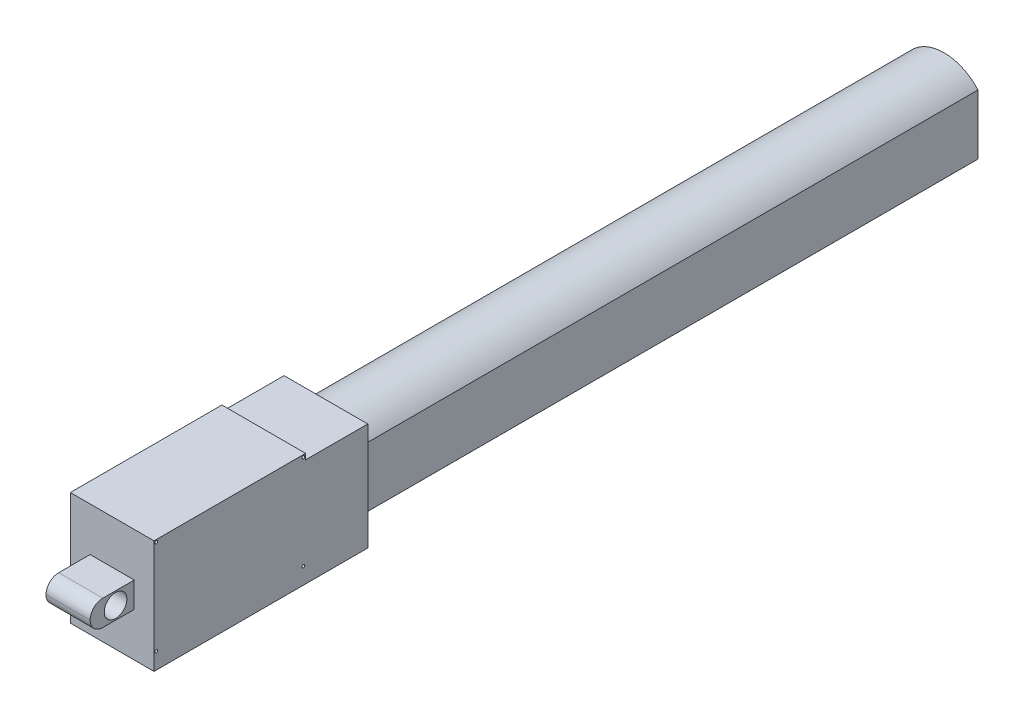
ISO-10303-21;
HEADER;
FILE_DESCRIPTION(('STEP AP214'),'2;1');
FILE_NAME('part.step','',(''),(''),'','','');
FILE_SCHEMA(('AUTOMOTIVE_DESIGN { 1 0 10303 214 1 1 1 1 }'));
ENDSEC;
DATA;
#1=APPLICATION_CONTEXT('core data for automotive mechanical design processes');
#2=APPLICATION_PROTOCOL_DEFINITION('international standard','automotive_design',2000,#1);
#3=PRODUCT_CONTEXT('',#1,'mechanical');
#4=PRODUCT('Part','Part','',(#3));
#5=PRODUCT_RELATED_PRODUCT_CATEGORY('part','',(#4));
#6=PRODUCT_DEFINITION_FORMATION('','',#4);
#7=PRODUCT_DEFINITION_CONTEXT('part definition',#1,'design');
#8=PRODUCT_DEFINITION('design','',#6,#7);
#9=PRODUCT_DEFINITION_SHAPE('','',#8);
#10=(LENGTH_UNIT() NAMED_UNIT(*) SI_UNIT(.MILLI.,.METRE.));
#11=(NAMED_UNIT(*) PLANE_ANGLE_UNIT() SI_UNIT($,.RADIAN.));
#12=(NAMED_UNIT(*) SI_UNIT($,.STERADIAN.) SOLID_ANGLE_UNIT());
#13=UNCERTAINTY_MEASURE_WITH_UNIT(LENGTH_MEASURE(1.E-05),#10,'distance_accuracy_value','');
#14=(GEOMETRIC_REPRESENTATION_CONTEXT(3) GLOBAL_UNCERTAINTY_ASSIGNED_CONTEXT((#13)) GLOBAL_UNIT_ASSIGNED_CONTEXT((#10,
#11,#12)) REPRESENTATION_CONTEXT('',''));
#15=CARTESIAN_POINT('',(0.,0.,0.));
#16=DIRECTION('',(0.,0.,1.));
#17=DIRECTION('',(1.,0.,0.));
#18=AXIS2_PLACEMENT_3D('',#15,#16,#17);
#19=CARTESIAN_POINT('',(0.,0.,0.));
#20=DIRECTION('',(0.,0.,1.));
#21=DIRECTION('',(1.,0.,0.));
#22=AXIS2_PLACEMENT_3D('',#19,#20,#21);
#23=PLANE('',#22);
#24=CARTESIAN_POINT('',(0.,0.,0.));
#25=DIRECTION('',(0.,0.,1.));
#26=DIRECTION('',(1.,0.,0.));
#27=AXIS2_PLACEMENT_3D('',#24,#25,#26);
#28=CIRCLE('',#27,8.);
#29=CARTESIAN_POINT('',(-6.,-5.29150262212918,0.));
#30=VERTEX_POINT('',#29);
#31=CARTESIAN_POINT('',(6.,-5.29150262212918,0.));
#32=VERTEX_POINT('',#31);
#33=EDGE_CURVE('E325',#30,#32,#28,.T.);
#34=ORIENTED_EDGE('',*,*,#33,.F.);
#35=DIRECTION('',(0.,-1.,0.));
#36=VECTOR('',#35,1.);
#37=CARTESIAN_POINT('',(-6.,-5.29150262212918,0.));
#38=LINE('',#37,#36);
#39=CARTESIAN_POINT('',(-6.,5.29150262212918,0.));
#40=VERTEX_POINT('',#39);
#41=EDGE_CURVE('E331',#40,#30,#38,.T.);
#42=ORIENTED_EDGE('',*,*,#41,.F.);
#43=CARTESIAN_POINT('',(0.,0.,0.));
#44=DIRECTION('',(0.,0.,1.));
#45=DIRECTION('',(1.,0.,0.));
#46=AXIS2_PLACEMENT_3D('',#43,#44,#45);
#47=CIRCLE('',#46,8.);
#48=CARTESIAN_POINT('',(6.,5.29150262212918,0.));
#49=VERTEX_POINT('',#48);
#50=EDGE_CURVE('E350',#49,#40,#47,.T.);
#51=ORIENTED_EDGE('',*,*,#50,.F.);
#52=DIRECTION('',(0.,1.,0.));
#53=VECTOR('',#52,1.);
#54=CARTESIAN_POINT('',(6.,-5.29150262212918,0.));
#55=LINE('',#54,#53);
#56=EDGE_CURVE('E347',#32,#49,#55,.T.);
#57=ORIENTED_EDGE('',*,*,#56,.F.);
#58=EDGE_LOOP('',(#34,#42,#51,#57));
#59=FACE_BOUND('',#58,.T.);
#60=CARTESIAN_POINT('',(0.,0.,0.));
#61=DIRECTION('',(0.,0.,1.));
#62=DIRECTION('',(1.,0.,0.));
#63=AXIS2_PLACEMENT_3D('',#60,#61,#62);
#64=CIRCLE('',#63,4.5);
#65=CARTESIAN_POINT('',(3.05,3.30870065131314,0.));
#66=VERTEX_POINT('',#65);
#67=CARTESIAN_POINT('',(-3.05,3.30870065131314,0.));
#68=VERTEX_POINT('',#67);
#69=EDGE_CURVE('E295',#66,#68,#64,.T.);
#70=ORIENTED_EDGE('',*,*,#69,.T.);
#71=DIRECTION('',(0.,-1.,0.));
#72=VECTOR('',#71,1.);
#73=CARTESIAN_POINT('',(-3.05,-3.30870065131314,0.));
#74=LINE('',#73,#72);
#75=CARTESIAN_POINT('',(-3.05,-3.30870065131314,0.));
#76=VERTEX_POINT('',#75);
#77=EDGE_CURVE('E299',#68,#76,#74,.T.);
#78=ORIENTED_EDGE('',*,*,#77,.T.);
#79=CARTESIAN_POINT('',(0.,0.,0.));
#80=DIRECTION('',(0.,0.,1.));
#81=DIRECTION('',(1.,0.,0.));
#82=AXIS2_PLACEMENT_3D('',#79,#80,#81);
#83=CIRCLE('',#82,4.5);
#84=CARTESIAN_POINT('',(3.05,-3.30870065131314,0.));
#85=VERTEX_POINT('',#84);
#86=EDGE_CURVE('E303',#76,#85,#83,.T.);
#87=ORIENTED_EDGE('',*,*,#86,.T.);
#88=DIRECTION('',(0.,1.,0.));
#89=VECTOR('',#88,1.);
#90=CARTESIAN_POINT('',(3.05,-3.30870065131314,0.));
#91=LINE('',#90,#89);
#92=EDGE_CURVE('E307',#85,#66,#91,.T.);
#93=ORIENTED_EDGE('',*,*,#92,.T.);
#94=EDGE_LOOP('',(#70,#78,#87,#93));
#95=FACE_BOUND('',#94,.T.);
#96=ADVANCED_FACE('F43',(#59,#95),#23,.F.);
#97=CARTESIAN_POINT('',(0.,0.,109.3));
#98=DIRECTION('',(0.,0.,-1.));
#99=DIRECTION('',(-1.,0.,0.));
#100=AXIS2_PLACEMENT_3D('',#97,#98,#99);
#101=CYLINDRICAL_SURFACE('',#100,8.);
#102=ORIENTED_EDGE('',*,*,#33,.T.);
#103=DIRECTION('',(0.,0.,-1.));
#104=VECTOR('',#103,1.);
#105=CARTESIAN_POINT('',(6.,-5.29150262212918,109.3));
#106=LINE('',#105,#104);
#107=CARTESIAN_POINT('',(6.,-5.29150262212918,109.3));
#108=VERTEX_POINT('',#107);
#109=EDGE_CURVE('E366',#108,#32,#106,.T.);
#110=ORIENTED_EDGE('',*,*,#109,.F.);
#111=CARTESIAN_POINT('',(0.,0.,109.3));
#112=DIRECTION('',(0.,0.,1.));
#113=DIRECTION('',(1.,0.,0.));
#114=AXIS2_PLACEMENT_3D('',#111,#112,#113);
#115=CIRCLE('',#114,8.);
#116=CARTESIAN_POINT('',(-6.,-5.29150262212918,109.3));
#117=VERTEX_POINT('',#116);
#118=EDGE_CURVE('E326',#117,#108,#115,.T.);
#119=ORIENTED_EDGE('',*,*,#118,.F.);
#120=DIRECTION('',(0.,0.,-1.));
#121=VECTOR('',#120,1.);
#122=CARTESIAN_POINT('',(-6.,-5.29150262212918,109.3));
#123=LINE('',#122,#121);
#124=EDGE_CURVE('E343',#117,#30,#123,.T.);
#125=ORIENTED_EDGE('',*,*,#124,.T.);
#126=EDGE_LOOP('',(#102,#110,#119,#125));
#127=FACE_BOUND('',#126,.T.);
#128=ADVANCED_FACE('F431',(#127),#101,.T.);
#129=CARTESIAN_POINT('',(6.,-5.29150262212918,109.3));
#130=DIRECTION('',(-1.,0.,0.));
#131=DIRECTION('',(0.,0.,1.));
#132=AXIS2_PLACEMENT_3D('',#129,#130,#131);
#133=PLANE('',#132);
#134=ORIENTED_EDGE('',*,*,#56,.T.);
#135=DIRECTION('',(0.,0.,-1.));
#136=VECTOR('',#135,1.);
#137=CARTESIAN_POINT('',(6.,5.29150262212918,109.3));
#138=LINE('',#137,#136);
#139=CARTESIAN_POINT('',(6.,5.29150262212918,109.3));
#140=VERTEX_POINT('',#139);
#141=EDGE_CURVE('E362',#140,#49,#138,.T.);
#142=ORIENTED_EDGE('',*,*,#141,.F.);
#143=DIRECTION('',(0.,1.,0.));
#144=VECTOR('',#143,1.);
#145=CARTESIAN_POINT('',(6.,-5.29150262212918,109.3));
#146=LINE('',#145,#144);
#147=EDGE_CURVE('E330',#108,#140,#146,.T.);
#148=ORIENTED_EDGE('',*,*,#147,.F.);
#149=ORIENTED_EDGE('',*,*,#109,.T.);
#150=EDGE_LOOP('',(#134,#142,#148,#149));
#151=FACE_BOUND('',#150,.T.);
#152=ADVANCED_FACE('F437',(#151),#133,.F.);
#153=CARTESIAN_POINT('',(0.,0.,109.3));
#154=DIRECTION('',(0.,0.,-1.));
#155=DIRECTION('',(-1.,0.,0.));
#156=AXIS2_PLACEMENT_3D('',#153,#154,#155);
#157=CYLINDRICAL_SURFACE('',#156,8.);
#158=ORIENTED_EDGE('',*,*,#50,.T.);
#159=DIRECTION('',(0.,0.,-1.));
#160=VECTOR('',#159,1.);
#161=CARTESIAN_POINT('',(-6.,5.29150262212918,109.3));
#162=LINE('',#161,#160);
#163=CARTESIAN_POINT('',(-6.,5.29150262212918,109.3));
#164=VERTEX_POINT('',#163);
#165=EDGE_CURVE('E358',#164,#40,#162,.T.);
#166=ORIENTED_EDGE('',*,*,#165,.F.);
#167=CARTESIAN_POINT('',(0.,0.,109.3));
#168=DIRECTION('',(0.,0.,1.));
#169=DIRECTION('',(1.,0.,0.));
#170=AXIS2_PLACEMENT_3D('',#167,#168,#169);
#171=CIRCLE('',#170,8.);
#172=EDGE_CURVE('E335',#140,#164,#171,.T.);
#173=ORIENTED_EDGE('',*,*,#172,.F.);
#174=ORIENTED_EDGE('',*,*,#141,.T.);
#175=EDGE_LOOP('',(#158,#166,#173,#174));
#176=FACE_BOUND('',#175,.T.);
#177=ADVANCED_FACE('F449',(#176),#157,.T.);
#178=CARTESIAN_POINT('',(-6.,-5.29150262212918,109.3));
#179=DIRECTION('',(1.,0.,0.));
#180=DIRECTION('',(0.,0.,-1.));
#181=AXIS2_PLACEMENT_3D('',#178,#179,#180);
#182=PLANE('',#181);
#183=ORIENTED_EDGE('',*,*,#41,.T.);
#184=ORIENTED_EDGE('',*,*,#124,.F.);
#185=DIRECTION('',(0.,-1.,0.));
#186=VECTOR('',#185,1.);
#187=CARTESIAN_POINT('',(-6.,-5.29150262212918,109.3));
#188=LINE('',#187,#186);
#189=EDGE_CURVE('E339',#164,#117,#188,.T.);
#190=ORIENTED_EDGE('',*,*,#189,.F.);
#191=ORIENTED_EDGE('',*,*,#165,.T.);
#192=EDGE_LOOP('',(#183,#184,#190,#191));
#193=FACE_BOUND('',#192,.T.);
#194=ADVANCED_FACE('F446',(#193),#182,.F.);
#195=CARTESIAN_POINT('',(0.,0.,109.3));
#196=DIRECTION('',(0.,0.,-1.));
#197=DIRECTION('',(-1.,0.,0.));
#198=AXIS2_PLACEMENT_3D('',#195,#196,#197);
#199=CYLINDRICAL_SURFACE('',#198,4.5);
#200=ORIENTED_EDGE('',*,*,#69,.F.);
#201=DIRECTION('',(0.,0.,-1.));
#202=VECTOR('',#201,1.);
#203=CARTESIAN_POINT('',(3.05,3.30870065131314,109.3));
#204=LINE('',#203,#202);
#205=CARTESIAN_POINT('',(3.05,3.30870065131314,145.7));
#206=VERTEX_POINT('',#205);
#207=EDGE_CURVE('E311',#206,#66,#204,.T.);
#208=ORIENTED_EDGE('',*,*,#207,.F.);
#209=CARTESIAN_POINT('',(0.,0.,145.7));
#210=DIRECTION('',(0.,0.,1.));
#211=DIRECTION('',(1.,0.,0.));
#212=AXIS2_PLACEMENT_3D('',#209,#210,#211);
#213=CIRCLE('',#212,4.5);
#214=CARTESIAN_POINT('',(-3.05,3.30870065131314,145.7));
#215=VERTEX_POINT('',#214);
#216=EDGE_CURVE('E228',#206,#215,#213,.T.);
#217=ORIENTED_EDGE('',*,*,#216,.T.);
#218=DIRECTION('',(0.,0.,-1.));
#219=VECTOR('',#218,1.);
#220=CARTESIAN_POINT('',(-3.05,3.30870065131314,109.3));
#221=LINE('',#220,#219);
#222=EDGE_CURVE('E321',#215,#68,#221,.T.);
#223=ORIENTED_EDGE('',*,*,#222,.T.);
#224=EDGE_LOOP('',(#200,#208,#217,#223));
#225=FACE_BOUND('',#224,.T.);
#226=ADVANCED_FACE('F444',(#225),#199,.F.);
#227=CARTESIAN_POINT('',(-3.05,-3.30870065131314,109.3));
#228=DIRECTION('',(1.,0.,0.));
#229=DIRECTION('',(0.,0.,-1.));
#230=AXIS2_PLACEMENT_3D('',#227,#228,#229);
#231=PLANE('',#230);
#232=ORIENTED_EDGE('',*,*,#77,.F.);
#233=ORIENTED_EDGE('',*,*,#222,.F.);
#234=DIRECTION('',(0.,-1.,0.));
#235=VECTOR('',#234,1.);
#236=CARTESIAN_POINT('',(-3.05,3.30870065131314,145.7));
#237=LINE('',#236,#235);
#238=CARTESIAN_POINT('',(-3.05,-3.30870065131314,145.7));
#239=VERTEX_POINT('',#238);
#240=EDGE_CURVE('E232',#215,#239,#237,.T.);
#241=ORIENTED_EDGE('',*,*,#240,.T.);
#242=DIRECTION('',(0.,0.,-1.));
#243=VECTOR('',#242,1.);
#244=CARTESIAN_POINT('',(-3.05,-3.30870065131314,109.3));
#245=LINE('',#244,#243);
#246=EDGE_CURVE('E318',#239,#76,#245,.T.);
#247=ORIENTED_EDGE('',*,*,#246,.T.);
#248=EDGE_LOOP('',(#232,#233,#241,#247));
#249=FACE_BOUND('',#248,.T.);
#250=ADVANCED_FACE('F553',(#249),#231,.T.);
#251=CARTESIAN_POINT('',(0.,0.,109.3));
#252=DIRECTION('',(0.,0.,-1.));
#253=DIRECTION('',(-1.,0.,0.));
#254=AXIS2_PLACEMENT_3D('',#251,#252,#253);
#255=CYLINDRICAL_SURFACE('',#254,4.5);
#256=ORIENTED_EDGE('',*,*,#86,.F.);
#257=ORIENTED_EDGE('',*,*,#246,.F.);
#258=CARTESIAN_POINT('',(0.,0.,145.7));
#259=DIRECTION('',(0.,0.,1.));
#260=DIRECTION('',(1.,0.,0.));
#261=AXIS2_PLACEMENT_3D('',#258,#259,#260);
#262=CIRCLE('',#261,4.5);
#263=CARTESIAN_POINT('',(3.05,-3.30870065131314,145.7));
#264=VERTEX_POINT('',#263);
#265=EDGE_CURVE('E236',#239,#264,#262,.T.);
#266=ORIENTED_EDGE('',*,*,#265,.T.);
#267=DIRECTION('',(0.,0.,-1.));
#268=VECTOR('',#267,1.);
#269=CARTESIAN_POINT('',(3.05,-3.30870065131314,109.3));
#270=LINE('',#269,#268);
#271=EDGE_CURVE('E315',#264,#85,#270,.T.);
#272=ORIENTED_EDGE('',*,*,#271,.T.);
#273=EDGE_LOOP('',(#256,#257,#266,#272));
#274=FACE_BOUND('',#273,.T.);
#275=ADVANCED_FACE('F550',(#274),#255,.F.);
#276=CARTESIAN_POINT('',(3.05,-3.30870065131314,109.3));
#277=DIRECTION('',(-1.,0.,0.));
#278=DIRECTION('',(0.,0.,1.));
#279=AXIS2_PLACEMENT_3D('',#276,#277,#278);
#280=PLANE('',#279);
#281=ORIENTED_EDGE('',*,*,#92,.F.);
#282=ORIENTED_EDGE('',*,*,#271,.F.);
#283=DIRECTION('',(0.,1.,0.));
#284=VECTOR('',#283,1.);
#285=CARTESIAN_POINT('',(3.05,-3.30870065131314,145.7));
#286=LINE('',#285,#284);
#287=EDGE_CURVE('E240',#264,#206,#286,.T.);
#288=ORIENTED_EDGE('',*,*,#287,.T.);
#289=ORIENTED_EDGE('',*,*,#207,.T.);
#290=EDGE_LOOP('',(#281,#282,#288,#289));
#291=FACE_BOUND('',#290,.T.);
#292=ADVANCED_FACE('F547',(#291),#280,.T.);
#293=CARTESIAN_POINT('',(0.,0.,109.3));
#294=DIRECTION('',(0.,0.,-1.));
#295=DIRECTION('',(-1.,0.,0.));
#296=AXIS2_PLACEMENT_3D('',#293,#294,#295);
#297=PLANE('',#296);
#298=ORIENTED_EDGE('',*,*,#189,.T.);
#299=ORIENTED_EDGE('',*,*,#118,.T.);
#300=ORIENTED_EDGE('',*,*,#147,.T.);
#301=ORIENTED_EDGE('',*,*,#172,.T.);
#302=EDGE_LOOP('',(#298,#299,#300,#301));
#303=FACE_BOUND('',#302,.T.);
#304=DIRECTION('',(0.,1.,0.));
#305=VECTOR('',#304,1.);
#306=CARTESIAN_POINT('',(7.4,-9.5,109.3));
#307=LINE('',#306,#305);
#308=CARTESIAN_POINT('',(7.4,-9.5,109.3));
#309=VERTEX_POINT('',#308);
#310=CARTESIAN_POINT('',(7.4,9.5,109.3));
#311=VERTEX_POINT('',#310);
#312=EDGE_CURVE('E262',#309,#311,#307,.T.);
#313=ORIENTED_EDGE('',*,*,#312,.F.);
#314=DIRECTION('',(1.,0.,0.));
#315=VECTOR('',#314,1.);
#316=CARTESIAN_POINT('',(-7.4,-9.5,109.3));
#317=LINE('',#316,#315);
#318=CARTESIAN_POINT('',(-7.4,-9.5,109.3));
#319=VERTEX_POINT('',#318);
#320=EDGE_CURVE('E268',#319,#309,#317,.T.);
#321=ORIENTED_EDGE('',*,*,#320,.F.);
#322=DIRECTION('',(0.,-1.,0.));
#323=VECTOR('',#322,1.);
#324=CARTESIAN_POINT('',(-7.4,-9.5,109.3));
#325=LINE('',#324,#323);
#326=CARTESIAN_POINT('',(-7.4,9.5,109.3));
#327=VERTEX_POINT('',#326);
#328=EDGE_CURVE('E275',#327,#319,#325,.T.);
#329=ORIENTED_EDGE('',*,*,#328,.F.);
#330=DIRECTION('',(-1.,0.,0.));
#331=VECTOR('',#330,1.);
#332=CARTESIAN_POINT('',(-7.4,9.5,109.3));
#333=LINE('',#332,#331);
#334=EDGE_CURVE('E272',#311,#327,#333,.T.);
#335=ORIENTED_EDGE('',*,*,#334,.F.);
#336=EDGE_LOOP('',(#313,#321,#329,#335));
#337=FACE_BOUND('',#336,.T.);
#338=ADVANCED_FACE('F525',(#303,#337),#297,.T.);
#339=CARTESIAN_POINT('',(7.4,-9.5,120.3));
#340=DIRECTION('',(-1.,0.,0.));
#341=DIRECTION('',(0.,0.,1.));
#342=AXIS2_PLACEMENT_3D('',#339,#340,#341);
#343=PLANE('',#342);
#344=CARTESIAN_POINT('',(7.4,-6.6,120.7));
#345=DIRECTION('',(-1.,0.,0.));
#346=DIRECTION('',(0.,0.,1.));
#347=AXIS2_PLACEMENT_3D('',#344,#345,#346);
#348=CIRCLE('',#347,0.25);
#349=CARTESIAN_POINT('',(7.4,-6.6,120.95));
#350=VERTEX_POINT('',#349);
#351=EDGE_CURVE('E408',#350,#350,#348,.T.);
#352=ORIENTED_EDGE('',*,*,#351,.T.);
#353=EDGE_LOOP('',(#352));
#354=FACE_BOUND('',#353,.T.);
#355=CARTESIAN_POINT('',(7.4,10.1,146.7));
#356=DIRECTION('',(-1.,0.,0.));
#357=DIRECTION('',(0.,0.,1.));
#358=AXIS2_PLACEMENT_3D('',#355,#356,#357);
#359=CIRCLE('',#358,0.250000000000013);
#360=CARTESIAN_POINT('',(7.4,10.1,146.95));
#361=VERTEX_POINT('',#360);
#362=EDGE_CURVE('E487',#361,#361,#359,.T.);
#363=ORIENTED_EDGE('',*,*,#362,.T.);
#364=EDGE_LOOP('',(#363));
#365=FACE_BOUND('',#364,.T.);
#366=CARTESIAN_POINT('',(7.4,-6.6,146.7));
#367=DIRECTION('',(-1.,0.,0.));
#368=DIRECTION('',(0.,0.,1.));
#369=AXIS2_PLACEMENT_3D('',#366,#367,#368);
#370=CIRCLE('',#369,0.250000000000013);
#371=CARTESIAN_POINT('',(7.4,-6.6,146.95));
#372=VERTEX_POINT('',#371);
#373=EDGE_CURVE('E498',#372,#372,#370,.T.);
#374=ORIENTED_EDGE('',*,*,#373,.T.);
#375=EDGE_LOOP('',(#374));
#376=FACE_BOUND('',#375,.T.);
#377=CARTESIAN_POINT('',(7.4,10.1,120.7));
#378=DIRECTION('',(-1.,0.,0.));
#379=DIRECTION('',(0.,0.,1.));
#380=AXIS2_PLACEMENT_3D('',#377,#378,#379);
#381=CIRCLE('',#380,0.25);
#382=CARTESIAN_POINT('',(7.4,10.1,120.95));
#383=VERTEX_POINT('',#382);
#384=EDGE_CURVE('E396',#383,#383,#381,.T.);
#385=ORIENTED_EDGE('',*,*,#384,.T.);
#386=EDGE_LOOP('',(#385));
#387=FACE_BOUND('',#386,.T.);
#388=ORIENTED_EDGE('',*,*,#312,.T.);
#389=DIRECTION('',(0.,0.,-1.));
#390=VECTOR('',#389,1.);
#391=CARTESIAN_POINT('',(7.4,9.5,120.3));
#392=LINE('',#391,#390);
#393=CARTESIAN_POINT('',(7.4,9.5,120.3));
#394=VERTEX_POINT('',#393);
#395=EDGE_CURVE('E291',#394,#311,#392,.T.);
#396=ORIENTED_EDGE('',*,*,#395,.F.);
#397=DIRECTION('',(0.,1.,0.));
#398=VECTOR('',#397,1.);
#399=CARTESIAN_POINT('',(7.4,-9.5,120.3));
#400=LINE('',#399,#398);
#401=CARTESIAN_POINT('',(7.4,10.5,120.3));
#402=VERTEX_POINT('',#401);
#403=EDGE_CURVE('E244',#394,#402,#400,.T.);
#404=ORIENTED_EDGE('',*,*,#403,.T.);
#405=DIRECTION('',(0.,0.,-1.));
#406=VECTOR('',#405,1.);
#407=CARTESIAN_POINT('',(7.4,10.5,145.7));
#408=LINE('',#407,#406);
#409=CARTESIAN_POINT('',(7.4,10.5,147.1));
#410=VERTEX_POINT('',#409);
#411=EDGE_CURVE('E258',#410,#402,#408,.T.);
#412=ORIENTED_EDGE('',*,*,#411,.F.);
#413=DIRECTION('',(0.,1.,0.));
#414=VECTOR('',#413,1.);
#415=CARTESIAN_POINT('',(7.4,-9.5,147.1));
#416=LINE('',#415,#414);
#417=CARTESIAN_POINT('',(7.4,-9.5,147.1));
#418=VERTEX_POINT('',#417);
#419=EDGE_CURVE('E220',#418,#410,#416,.T.);
#420=ORIENTED_EDGE('',*,*,#419,.F.);
#421=DIRECTION('',(0.,0.,-1.));
#422=VECTOR('',#421,1.);
#423=CARTESIAN_POINT('',(7.4,-9.5,120.3));
#424=LINE('',#423,#422);
#425=EDGE_CURVE('E267',#418,#309,#424,.T.);
#426=ORIENTED_EDGE('',*,*,#425,.T.);
#427=EDGE_LOOP('',(#388,#396,#404,#412,#420,#426));
#428=FACE_BOUND('',#427,.T.);
#429=ADVANCED_FACE('F528',(#354,#365,#376,#387,#428),#343,.F.);
#430=CARTESIAN_POINT('',(-7.4,9.5,120.3));
#431=DIRECTION('',(0.,-1.,0.));
#432=DIRECTION('',(0.,0.,-1.));
#433=AXIS2_PLACEMENT_3D('',#430,#431,#432);
#434=PLANE('',#433);
#435=ORIENTED_EDGE('',*,*,#334,.T.);
#436=DIRECTION('',(0.,0.,-1.));
#437=VECTOR('',#436,1.);
#438=CARTESIAN_POINT('',(-7.4,9.5,120.3));
#439=LINE('',#438,#437);
#440=CARTESIAN_POINT('',(-7.4,9.5,120.3));
#441=VERTEX_POINT('',#440);
#442=EDGE_CURVE('E287',#441,#327,#439,.T.);
#443=ORIENTED_EDGE('',*,*,#442,.F.);
#444=DIRECTION('',(-1.,0.,0.));
#445=VECTOR('',#444,1.);
#446=CARTESIAN_POINT('',(-7.4,9.5,120.3));
#447=LINE('',#446,#445);
#448=EDGE_CURVE('E263',#394,#441,#447,.T.);
#449=ORIENTED_EDGE('',*,*,#448,.F.);
#450=ORIENTED_EDGE('',*,*,#395,.T.);
#451=EDGE_LOOP('',(#435,#443,#449,#450));
#452=FACE_BOUND('',#451,.T.);
#453=ADVANCED_FACE('F512',(#452),#434,.F.);
#454=CARTESIAN_POINT('',(-7.4,-9.5,120.3));
#455=DIRECTION('',(1.,0.,0.));
#456=DIRECTION('',(0.,0.,-1.));
#457=AXIS2_PLACEMENT_3D('',#454,#455,#456);
#458=PLANE('',#457);
#459=CARTESIAN_POINT('',(-7.4,-6.6,120.7));
#460=DIRECTION('',(-1.,0.,0.));
#461=DIRECTION('',(0.,0.,1.));
#462=AXIS2_PLACEMENT_3D('',#459,#460,#461);
#463=CIRCLE('',#462,0.25);
#464=CARTESIAN_POINT('',(-7.4,-6.6,120.95));
#465=VERTEX_POINT('',#464);
#466=EDGE_CURVE('E484',#465,#465,#463,.T.);
#467=ORIENTED_EDGE('',*,*,#466,.F.);
#468=EDGE_LOOP('',(#467));
#469=FACE_BOUND('',#468,.T.);
#470=CARTESIAN_POINT('',(-7.4,10.1,146.7));
#471=DIRECTION('',(-1.,0.,0.));
#472=DIRECTION('',(0.,0.,1.));
#473=AXIS2_PLACEMENT_3D('',#470,#471,#472);
#474=CIRCLE('',#473,0.250000000000013);
#475=CARTESIAN_POINT('',(-7.4,10.1,146.95));
#476=VERTEX_POINT('',#475);
#477=EDGE_CURVE('E411',#476,#476,#474,.T.);
#478=ORIENTED_EDGE('',*,*,#477,.F.);
#479=EDGE_LOOP('',(#478));
#480=FACE_BOUND('',#479,.T.);
#481=CARTESIAN_POINT('',(-7.4,-6.6,146.7));
#482=DIRECTION('',(-1.,0.,0.));
#483=DIRECTION('',(0.,0.,1.));
#484=AXIS2_PLACEMENT_3D('',#481,#482,#483);
#485=CIRCLE('',#484,0.250000000000013);
#486=CARTESIAN_POINT('',(-7.4,-6.6,146.95));
#487=VERTEX_POINT('',#486);
#488=EDGE_CURVE('E494',#487,#487,#485,.T.);
#489=ORIENTED_EDGE('',*,*,#488,.F.);
#490=EDGE_LOOP('',(#489));
#491=FACE_BOUND('',#490,.T.);
#492=CARTESIAN_POINT('',(-7.4,10.1,120.7));
#493=DIRECTION('',(-1.,0.,0.));
#494=DIRECTION('',(0.,0.,1.));
#495=AXIS2_PLACEMENT_3D('',#492,#493,#494);
#496=CIRCLE('',#495,0.25);
#497=CARTESIAN_POINT('',(-7.4,10.1,120.95));
#498=VERTEX_POINT('',#497);
#499=EDGE_CURVE('E402',#498,#498,#496,.T.);
#500=ORIENTED_EDGE('',*,*,#499,.F.);
#501=EDGE_LOOP('',(#500));
#502=FACE_BOUND('',#501,.T.);
#503=ORIENTED_EDGE('',*,*,#328,.T.);
#504=DIRECTION('',(0.,0.,-1.));
#505=VECTOR('',#504,1.);
#506=CARTESIAN_POINT('',(-7.4,-9.5,120.3));
#507=LINE('',#506,#505);
#508=CARTESIAN_POINT('',(-7.4,-9.5,147.1));
#509=VERTEX_POINT('',#508);
#510=EDGE_CURVE('E283',#509,#319,#507,.T.);
#511=ORIENTED_EDGE('',*,*,#510,.F.);
#512=DIRECTION('',(0.,-1.,0.));
#513=VECTOR('',#512,1.);
#514=CARTESIAN_POINT('',(-7.4,10.5,147.1));
#515=LINE('',#514,#513);
#516=CARTESIAN_POINT('',(-7.4,10.5,147.1));
#517=VERTEX_POINT('',#516);
#518=EDGE_CURVE('E212',#517,#509,#515,.T.);
#519=ORIENTED_EDGE('',*,*,#518,.F.);
#520=DIRECTION('',(0.,0.,-1.));
#521=VECTOR('',#520,1.);
#522=CARTESIAN_POINT('',(-7.4,10.5,145.7));
#523=LINE('',#522,#521);
#524=CARTESIAN_POINT('',(-7.4,10.5,120.3));
#525=VERTEX_POINT('',#524);
#526=EDGE_CURVE('E254',#517,#525,#523,.T.);
#527=ORIENTED_EDGE('',*,*,#526,.T.);
#528=DIRECTION('',(0.,-1.,0.));
#529=VECTOR('',#528,1.);
#530=CARTESIAN_POINT('',(-7.4,-9.5,120.3));
#531=LINE('',#530,#529);
#532=EDGE_CURVE('E250',#525,#441,#531,.T.);
#533=ORIENTED_EDGE('',*,*,#532,.T.);
#534=ORIENTED_EDGE('',*,*,#442,.T.);
#535=EDGE_LOOP('',(#503,#511,#519,#527,#533,#534));
#536=FACE_BOUND('',#535,.T.);
#537=ADVANCED_FACE('F508',(#469,#480,#491,#502,#536),#458,.F.);
#538=CARTESIAN_POINT('',(-7.4,-9.5,120.3));
#539=DIRECTION('',(0.,1.,0.));
#540=DIRECTION('',(0.,0.,1.));
#541=AXIS2_PLACEMENT_3D('',#538,#539,#540);
#542=PLANE('',#541);
#543=ORIENTED_EDGE('',*,*,#320,.T.);
#544=ORIENTED_EDGE('',*,*,#425,.F.);
#545=DIRECTION('',(1.,0.,0.));
#546=VECTOR('',#545,1.);
#547=CARTESIAN_POINT('',(-7.4,-9.5,147.1));
#548=LINE('',#547,#546);
#549=EDGE_CURVE('E216',#509,#418,#548,.T.);
#550=ORIENTED_EDGE('',*,*,#549,.F.);
#551=ORIENTED_EDGE('',*,*,#510,.T.);
#552=EDGE_LOOP('',(#543,#544,#550,#551));
#553=FACE_BOUND('',#552,.T.);
#554=ADVANCED_FACE('F511',(#553),#542,.F.);
#555=CARTESIAN_POINT('',(0.,0.,120.3));
#556=DIRECTION('',(0.,0.,-1.));
#557=DIRECTION('',(-1.,0.,0.));
#558=AXIS2_PLACEMENT_3D('',#555,#556,#557);
#559=PLANE('',#558);
#560=ORIENTED_EDGE('',*,*,#403,.F.);
#561=ORIENTED_EDGE('',*,*,#448,.T.);
#562=ORIENTED_EDGE('',*,*,#532,.F.);
#563=DIRECTION('',(-1.,0.,0.));
#564=VECTOR('',#563,1.);
#565=CARTESIAN_POINT('',(-7.4,10.5,120.3));
#566=LINE('',#565,#564);
#567=EDGE_CURVE('E247',#402,#525,#566,.T.);
#568=ORIENTED_EDGE('',*,*,#567,.F.);
#569=EDGE_LOOP('',(#560,#561,#562,#568));
#570=FACE_BOUND('',#569,.T.);
#571=ADVANCED_FACE('F536',(#570),#559,.T.);
#572=CARTESIAN_POINT('',(-7.4,10.5,145.7));
#573=DIRECTION('',(0.,-1.,0.));
#574=DIRECTION('',(0.,0.,-1.));
#575=AXIS2_PLACEMENT_3D('',#572,#573,#574);
#576=PLANE('',#575);
#577=ORIENTED_EDGE('',*,*,#567,.T.);
#578=ORIENTED_EDGE('',*,*,#526,.F.);
#579=DIRECTION('',(-1.,0.,0.));
#580=VECTOR('',#579,1.);
#581=CARTESIAN_POINT('',(7.4,10.5,147.1));
#582=LINE('',#581,#580);
#583=EDGE_CURVE('E224',#410,#517,#582,.T.);
#584=ORIENTED_EDGE('',*,*,#583,.F.);
#585=ORIENTED_EDGE('',*,*,#411,.T.);
#586=EDGE_LOOP('',(#577,#578,#584,#585));
#587=FACE_BOUND('',#586,.T.);
#588=ADVANCED_FACE('F570',(#587),#576,.F.);
#589=CARTESIAN_POINT('',(0.,0.,145.7));
#590=DIRECTION('',(0.,0.,1.));
#591=DIRECTION('',(1.,0.,0.));
#592=AXIS2_PLACEMENT_3D('',#589,#590,#591);
#593=PLANE('',#592);
#594=ORIENTED_EDGE('',*,*,#216,.F.);
#595=ORIENTED_EDGE('',*,*,#287,.F.);
#596=ORIENTED_EDGE('',*,*,#265,.F.);
#597=ORIENTED_EDGE('',*,*,#240,.F.);
#598=EDGE_LOOP('',(#594,#595,#596,#597));
#599=FACE_BOUND('',#598,.T.);
#600=ADVANCED_FACE('F568',(#599),#593,.F.);
#601=CARTESIAN_POINT('',(0.,0.,147.1));
#602=DIRECTION('',(0.,0.,1.));
#603=DIRECTION('',(1.,0.,0.));
#604=AXIS2_PLACEMENT_3D('',#601,#602,#603);
#605=PLANE('',#604);
#606=DIRECTION('',(0.,1.,0.));
#607=VECTOR('',#606,1.);
#608=CARTESIAN_POINT('',(3.9,-1.75,147.1));
#609=LINE('',#608,#607);
#610=CARTESIAN_POINT('',(3.9,-1.75,147.1));
#611=VERTEX_POINT('',#610);
#612=CARTESIAN_POINT('',(3.9,2.75,147.1));
#613=VERTEX_POINT('',#612);
#614=EDGE_CURVE('E196',#611,#613,#609,.T.);
#615=ORIENTED_EDGE('',*,*,#614,.F.);
#616=DIRECTION('',(1.,0.,0.));
#617=VECTOR('',#616,1.);
#618=CARTESIAN_POINT('',(-3.9,-1.75,147.1));
#619=LINE('',#618,#617);
#620=CARTESIAN_POINT('',(-3.9,-1.75,147.1));
#621=VERTEX_POINT('',#620);
#622=EDGE_CURVE('E190',#621,#611,#619,.T.);
#623=ORIENTED_EDGE('',*,*,#622,.F.);
#624=DIRECTION('',(0.,-1.,0.));
#625=VECTOR('',#624,1.);
#626=CARTESIAN_POINT('',(-3.9,-1.75,147.1));
#627=LINE('',#626,#625);
#628=CARTESIAN_POINT('',(-3.9,2.75,147.1));
#629=VERTEX_POINT('',#628);
#630=EDGE_CURVE('E173',#629,#621,#627,.T.);
#631=ORIENTED_EDGE('',*,*,#630,.F.);
#632=DIRECTION('',(-1.,0.,0.));
#633=VECTOR('',#632,1.);
#634=CARTESIAN_POINT('',(-3.9,2.75,147.1));
#635=LINE('',#634,#633);
#636=EDGE_CURVE('E187',#613,#629,#635,.T.);
#637=ORIENTED_EDGE('',*,*,#636,.F.);
#638=EDGE_LOOP('',(#615,#623,#631,#637));
#639=FACE_BOUND('',#638,.T.);
#640=ORIENTED_EDGE('',*,*,#518,.T.);
#641=ORIENTED_EDGE('',*,*,#549,.T.);
#642=ORIENTED_EDGE('',*,*,#419,.T.);
#643=ORIENTED_EDGE('',*,*,#583,.T.);
#644=EDGE_LOOP('',(#640,#641,#642,#643));
#645=FACE_BOUND('',#644,.T.);
#646=ADVANCED_FACE('F185',(#639,#645),#605,.T.);
#647=CARTESIAN_POINT('',(3.9,-1.75,154.9));
#648=DIRECTION('',(-1.,0.,0.));
#649=DIRECTION('',(0.,0.,1.));
#650=AXIS2_PLACEMENT_3D('',#647,#648,#649);
#651=PLANE('',#650);
#652=CARTESIAN_POINT('',(3.9,0.500000000000001,150.4));
#653=DIRECTION('',(-1.,0.,0.));
#654=DIRECTION('',(0.,0.,1.));
#655=AXIS2_PLACEMENT_3D('',#652,#653,#654);
#656=CIRCLE('',#655,2.);
#657=CARTESIAN_POINT('',(3.9,0.500000000000001,152.4));
#658=VERTEX_POINT('',#657);
#659=EDGE_CURVE('E199',#658,#658,#656,.T.);
#660=ORIENTED_EDGE('',*,*,#659,.T.);
#661=EDGE_LOOP('',(#660));
#662=FACE_BOUND('',#661,.T.);
#663=CARTESIAN_POINT('',(3.9,0.500000000000001,152.65));
#664=DIRECTION('',(-1.,0.,0.));
#665=DIRECTION('',(0.,0.,1.));
#666=AXIS2_PLACEMENT_3D('',#663,#664,#665);
#667=CIRCLE('',#666,2.25);
#668=CARTESIAN_POINT('',(3.9,2.75,152.65));
#669=VERTEX_POINT('',#668);
#670=CARTESIAN_POINT('',(3.9,0.500000000000001,154.9));
#671=VERTEX_POINT('',#670);
#672=EDGE_CURVE('E370',#669,#671,#667,.F.);
#673=ORIENTED_EDGE('',*,*,#672,.T.);
#674=CARTESIAN_POINT('',(3.9,0.500000000000001,152.65));
#675=DIRECTION('',(-1.,0.,0.));
#676=DIRECTION('',(0.,0.,1.));
#677=AXIS2_PLACEMENT_3D('',#674,#675,#676);
#678=CIRCLE('',#677,2.25);
#679=CARTESIAN_POINT('',(3.9,-1.75,152.65));
#680=VERTEX_POINT('',#679);
#681=EDGE_CURVE('E373',#671,#680,#678,.F.);
#682=ORIENTED_EDGE('',*,*,#681,.T.);
#683=DIRECTION('',(0.,0.,-1.));
#684=VECTOR('',#683,1.);
#685=CARTESIAN_POINT('',(3.9,-1.75,154.9));
#686=LINE('',#685,#684);
#687=EDGE_CURVE('E205',#680,#611,#686,.T.);
#688=ORIENTED_EDGE('',*,*,#687,.T.);
#689=ORIENTED_EDGE('',*,*,#614,.T.);
#690=DIRECTION('',(0.,0.,-1.));
#691=VECTOR('',#690,1.);
#692=CARTESIAN_POINT('',(3.9,2.75,154.9));
#693=LINE('',#692,#691);
#694=EDGE_CURVE('E178',#669,#613,#693,.T.);
#695=ORIENTED_EDGE('',*,*,#694,.F.);
#696=EDGE_LOOP('',(#673,#682,#688,#689,#695));
#697=FACE_BOUND('',#696,.T.);
#698=ADVANCED_FACE('F417',(#662,#697),#651,.F.);
#699=CARTESIAN_POINT('',(-3.9,2.75,154.9));
#700=DIRECTION('',(0.,-1.,0.));
#701=DIRECTION('',(0.,0.,-1.));
#702=AXIS2_PLACEMENT_3D('',#699,#700,#701);
#703=PLANE('',#702);
#704=DIRECTION('',(0.,0.,-1.));
#705=VECTOR('',#704,1.);
#706=CARTESIAN_POINT('',(-3.9,2.75,154.9));
#707=LINE('',#706,#705);
#708=CARTESIAN_POINT('',(-3.9,2.75,152.65));
#709=VERTEX_POINT('',#708);
#710=EDGE_CURVE('E170',#709,#629,#707,.T.);
#711=ORIENTED_EDGE('',*,*,#710,.F.);
#712=DIRECTION('',(-1.,0.,0.));
#713=VECTOR('',#712,1.);
#714=CARTESIAN_POINT('',(-3.9,2.75,152.65));
#715=LINE('',#714,#713);
#716=EDGE_CURVE('E11',#709,#669,#715,.F.);
#717=ORIENTED_EDGE('',*,*,#716,.T.);
#718=ORIENTED_EDGE('',*,*,#694,.T.);
#719=ORIENTED_EDGE('',*,*,#636,.T.);
#720=EDGE_LOOP('',(#711,#717,#718,#719));
#721=FACE_BOUND('',#720,.T.);
#722=ADVANCED_FACE('F193',(#721),#703,.F.);
#723=CARTESIAN_POINT('',(-3.9,-1.75,154.9));
#724=DIRECTION('',(1.,0.,0.));
#725=DIRECTION('',(0.,0.,-1.));
#726=AXIS2_PLACEMENT_3D('',#723,#724,#725);
#727=PLANE('',#726);
#728=CARTESIAN_POINT('',(-3.9,0.500000000000001,150.4));
#729=DIRECTION('',(-1.,0.,0.));
#730=DIRECTION('',(0.,0.,1.));
#731=AXIS2_PLACEMENT_3D('',#728,#729,#730);
#732=CIRCLE('',#731,2.);
#733=CARTESIAN_POINT('',(-3.9,0.500000000000001,152.4));
#734=VERTEX_POINT('',#733);
#735=EDGE_CURVE('E395',#734,#734,#732,.T.);
#736=ORIENTED_EDGE('',*,*,#735,.F.);
#737=EDGE_LOOP('',(#736));
#738=FACE_BOUND('',#737,.T.);
#739=DIRECTION('',(0.,0.,-1.));
#740=VECTOR('',#739,1.);
#741=CARTESIAN_POINT('',(-3.9,-1.75,154.9));
#742=LINE('',#741,#740);
#743=CARTESIAN_POINT('',(-3.9,-1.75,152.65));
#744=VERTEX_POINT('',#743);
#745=EDGE_CURVE('E179',#744,#621,#742,.T.);
#746=ORIENTED_EDGE('',*,*,#745,.F.);
#747=CARTESIAN_POINT('',(-3.9,0.500000000000001,152.65));
#748=DIRECTION('',(1.,0.,0.));
#749=DIRECTION('',(0.,0.,-1.));
#750=AXIS2_PLACEMENT_3D('',#747,#748,#749);
#751=CIRCLE('',#750,2.25);
#752=CARTESIAN_POINT('',(-3.9,0.500000000000001,154.9));
#753=VERTEX_POINT('',#752);
#754=EDGE_CURVE('E53',#744,#753,#751,.F.);
#755=ORIENTED_EDGE('',*,*,#754,.T.);
#756=CARTESIAN_POINT('',(-3.9,0.500000000000001,152.65));
#757=DIRECTION('',(1.,0.,0.));
#758=DIRECTION('',(0.,0.,-1.));
#759=AXIS2_PLACEMENT_3D('',#756,#757,#758);
#760=CIRCLE('',#759,2.25);
#761=EDGE_CURVE('E60',#753,#709,#760,.F.);
#762=ORIENTED_EDGE('',*,*,#761,.T.);
#763=ORIENTED_EDGE('',*,*,#710,.T.);
#764=ORIENTED_EDGE('',*,*,#630,.T.);
#765=EDGE_LOOP('',(#746,#755,#762,#763,#764));
#766=FACE_BOUND('',#765,.T.);
#767=ADVANCED_FACE('F172',(#738,#766),#727,.F.);
#768=CARTESIAN_POINT('',(-3.9,-1.75,154.9));
#769=DIRECTION('',(0.,1.,0.));
#770=DIRECTION('',(0.,0.,1.));
#771=AXIS2_PLACEMENT_3D('',#768,#769,#770);
#772=PLANE('',#771);
#773=ORIENTED_EDGE('',*,*,#687,.F.);
#774=DIRECTION('',(1.,0.,0.));
#775=VECTOR('',#774,1.);
#776=CARTESIAN_POINT('',(-3.9,-1.75,152.65));
#777=LINE('',#776,#775);
#778=EDGE_CURVE('E376',#680,#744,#777,.F.);
#779=ORIENTED_EDGE('',*,*,#778,.T.);
#780=ORIENTED_EDGE('',*,*,#745,.T.);
#781=ORIENTED_EDGE('',*,*,#622,.T.);
#782=EDGE_LOOP('',(#773,#779,#780,#781));
#783=FACE_BOUND('',#782,.T.);
#784=ADVANCED_FACE('F386',(#783),#772,.F.);
#785=CARTESIAN_POINT('',(7.4,0.500000000000001,150.4));
#786=DIRECTION('',(-1.,0.,0.));
#787=DIRECTION('',(0.,0.,1.));
#788=AXIS2_PLACEMENT_3D('',#785,#786,#787);
#789=CYLINDRICAL_SURFACE('',#788,2.);
#790=ORIENTED_EDGE('',*,*,#735,.T.);
#791=EDGE_LOOP('',(#790));
#792=FACE_BOUND('',#791,.T.);
#793=ORIENTED_EDGE('',*,*,#659,.F.);
#794=EDGE_LOOP('',(#793));
#795=FACE_BOUND('',#794,.T.);
#796=ADVANCED_FACE('F420',(#792,#795),#789,.F.);
#797=CARTESIAN_POINT('',(0.,0.500000000000001,152.65));
#798=DIRECTION('',(-1.,0.,0.));
#799=DIRECTION('',(0.,0.,1.));
#800=AXIS2_PLACEMENT_3D('',#797,#798,#799);
#801=CYLINDRICAL_SURFACE('',#800,2.25);
#802=ORIENTED_EDGE('',*,*,#716,.F.);
#803=ORIENTED_EDGE('',*,*,#761,.F.);
#804=DIRECTION('',(-1.,0.,0.));
#805=VECTOR('',#804,1.);
#806=CARTESIAN_POINT('',(0.,0.500000000000001,154.9));
#807=LINE('',#806,#805);
#808=EDGE_CURVE('E47',#671,#753,#807,.T.);
#809=ORIENTED_EDGE('',*,*,#808,.F.);
#810=ORIENTED_EDGE('',*,*,#672,.F.);
#811=EDGE_LOOP('',(#802,#803,#809,#810));
#812=FACE_BOUND('',#811,.T.);
#813=ADVANCED_FACE('F45',(#812),#801,.T.);
#814=CARTESIAN_POINT('',(0.,0.500000000000001,152.65));
#815=DIRECTION('',(1.,0.,0.));
#816=DIRECTION('',(0.,0.,-1.));
#817=AXIS2_PLACEMENT_3D('',#814,#815,#816);
#818=CYLINDRICAL_SURFACE('',#817,2.25);
#819=ORIENTED_EDGE('',*,*,#754,.F.);
#820=ORIENTED_EDGE('',*,*,#778,.F.);
#821=ORIENTED_EDGE('',*,*,#681,.F.);
#822=ORIENTED_EDGE('',*,*,#808,.T.);
#823=EDGE_LOOP('',(#819,#820,#821,#822));
#824=FACE_BOUND('',#823,.T.);
#825=ADVANCED_FACE('F389',(#824),#818,.T.);
#826=CARTESIAN_POINT('',(7.4,10.1,120.7));
#827=DIRECTION('',(-1.,0.,0.));
#828=DIRECTION('',(0.,0.,1.));
#829=AXIS2_PLACEMENT_3D('',#826,#827,#828);
#830=CYLINDRICAL_SURFACE('',#829,0.25);
#831=ORIENTED_EDGE('',*,*,#384,.F.);
#832=EDGE_LOOP('',(#831));
#833=FACE_BOUND('',#832,.T.);
#834=ORIENTED_EDGE('',*,*,#499,.T.);
#835=EDGE_LOOP('',(#834));
#836=FACE_BOUND('',#835,.T.);
#837=ADVANCED_FACE('F457',(#833,#836),#830,.F.);
#838=CARTESIAN_POINT('',(7.4,-6.6,146.7));
#839=DIRECTION('',(-1.,0.,0.));
#840=DIRECTION('',(0.,0.,1.));
#841=AXIS2_PLACEMENT_3D('',#838,#839,#840);
#842=CYLINDRICAL_SURFACE('',#841,0.250000000000013);
#843=ORIENTED_EDGE('',*,*,#373,.F.);
#844=EDGE_LOOP('',(#843));
#845=FACE_BOUND('',#844,.T.);
#846=ORIENTED_EDGE('',*,*,#488,.T.);
#847=EDGE_LOOP('',(#846));
#848=FACE_BOUND('',#847,.T.);
#849=ADVANCED_FACE('F461',(#845,#848),#842,.F.);
#850=CARTESIAN_POINT('',(7.4,10.1,146.7));
#851=DIRECTION('',(-1.,0.,0.));
#852=DIRECTION('',(0.,0.,1.));
#853=AXIS2_PLACEMENT_3D('',#850,#851,#852);
#854=CYLINDRICAL_SURFACE('',#853,0.250000000000013);
#855=ORIENTED_EDGE('',*,*,#362,.F.);
#856=EDGE_LOOP('',(#855));
#857=FACE_BOUND('',#856,.T.);
#858=ORIENTED_EDGE('',*,*,#477,.T.);
#859=EDGE_LOOP('',(#858));
#860=FACE_BOUND('',#859,.T.);
#861=ADVANCED_FACE('F466',(#857,#860),#854,.F.);
#862=CARTESIAN_POINT('',(7.4,-6.6,120.7));
#863=DIRECTION('',(-1.,0.,0.));
#864=DIRECTION('',(0.,0.,1.));
#865=AXIS2_PLACEMENT_3D('',#862,#863,#864);
#866=CYLINDRICAL_SURFACE('',#865,0.25);
#867=ORIENTED_EDGE('',*,*,#351,.F.);
#868=EDGE_LOOP('',(#867));
#869=FACE_BOUND('',#868,.T.);
#870=ORIENTED_EDGE('',*,*,#466,.T.);
#871=EDGE_LOOP('',(#870));
#872=FACE_BOUND('',#871,.T.);
#873=ADVANCED_FACE('F473',(#869,#872),#866,.F.);
#874=CLOSED_SHELL('',(#96,#128,#152,#177,#194,#226,#250,#275,#292,#338,#429,#453,#537,#554,#571,
#588,#600,#646,#698,#722,#767,#784,#796,#813,#825,#837,#849,#861,#873));
#875=MANIFOLD_SOLID_BREP('B2',#874);
#876=ADVANCED_BREP_SHAPE_REPRESENTATION('',(#18,#875),#14);
#877=SHAPE_DEFINITION_REPRESENTATION(#9,#876);
ENDSEC;
END-ISO-10303-21;
